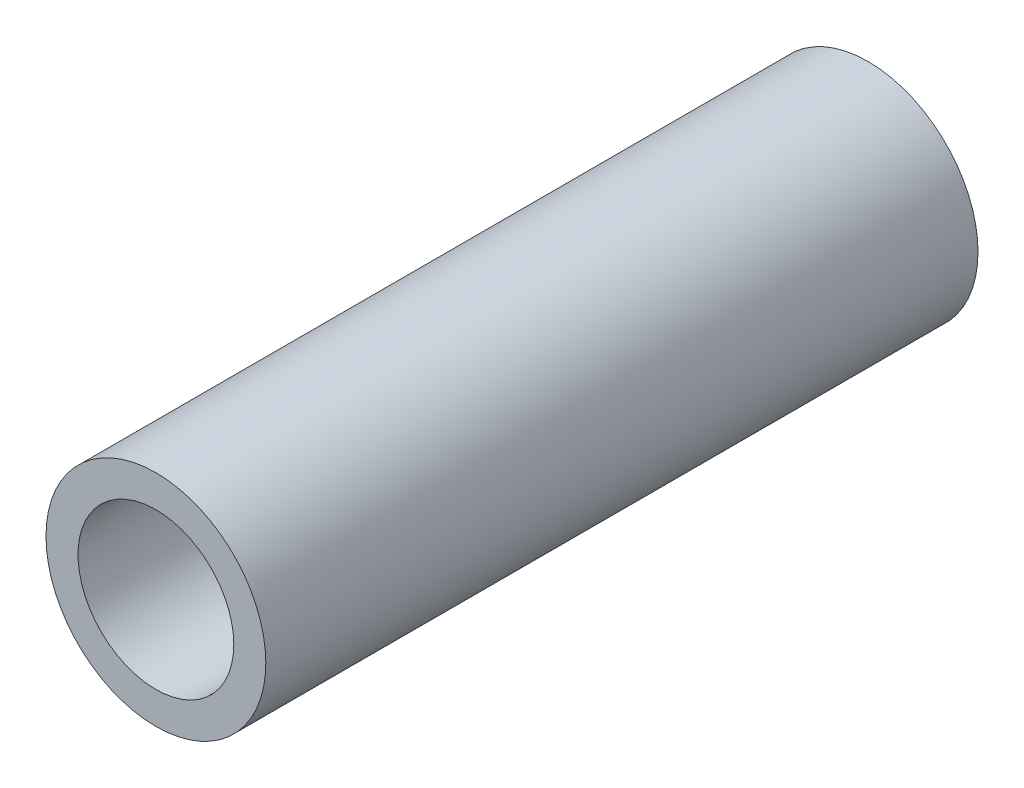
ISO-10303-21;
HEADER;
FILE_DESCRIPTION(('STEP AP214'),'2;1');
FILE_NAME('part.step','',(''),(''),'','','');
FILE_SCHEMA(('AUTOMOTIVE_DESIGN { 1 0 10303 214 1 1 1 1 }'));
ENDSEC;
DATA;
#1=APPLICATION_CONTEXT('core data for automotive mechanical design processes');
#2=APPLICATION_PROTOCOL_DEFINITION('international standard','automotive_design',2000,#1);
#3=PRODUCT_CONTEXT('',#1,'mechanical');
#4=PRODUCT('Part','Part','',(#3));
#5=PRODUCT_RELATED_PRODUCT_CATEGORY('part','',(#4));
#6=PRODUCT_DEFINITION_FORMATION('','',#4);
#7=PRODUCT_DEFINITION_CONTEXT('part definition',#1,'design');
#8=PRODUCT_DEFINITION('design','',#6,#7);
#9=PRODUCT_DEFINITION_SHAPE('','',#8);
#10=(LENGTH_UNIT() NAMED_UNIT(*) SI_UNIT(.MILLI.,.METRE.));
#11=(NAMED_UNIT(*) PLANE_ANGLE_UNIT() SI_UNIT($,.RADIAN.));
#12=(NAMED_UNIT(*) SI_UNIT($,.STERADIAN.) SOLID_ANGLE_UNIT());
#13=UNCERTAINTY_MEASURE_WITH_UNIT(LENGTH_MEASURE(1.E-05),#10,'distance_accuracy_value','');
#14=(GEOMETRIC_REPRESENTATION_CONTEXT(3) GLOBAL_UNCERTAINTY_ASSIGNED_CONTEXT((#13)) GLOBAL_UNIT_ASSIGNED_CONTEXT((#10,
#11,#12)) REPRESENTATION_CONTEXT('',''));
#15=CARTESIAN_POINT('',(0.,0.,0.));
#16=DIRECTION('',(0.,0.,1.));
#17=DIRECTION('',(1.,0.,0.));
#18=AXIS2_PLACEMENT_3D('',#15,#16,#17);
#19=CARTESIAN_POINT('',(0.,0.,20.574));
#20=DIRECTION('',(0.,0.,1.));
#21=DIRECTION('',(1.,0.,0.));
#22=AXIS2_PLACEMENT_3D('',#19,#20,#21);
#23=PLANE('',#22);
#24=CARTESIAN_POINT('',(0.,0.,20.574));
#25=DIRECTION('',(0.,0.,1.));
#26=DIRECTION('',(1.,0.,0.));
#27=AXIS2_PLACEMENT_3D('',#24,#25,#26);
#28=CIRCLE('',#27,3.175);
#29=CARTESIAN_POINT('',(3.175,0.,20.574));
#30=VERTEX_POINT('',#29);
#31=EDGE_CURVE('E10',#30,#30,#28,.T.);
#32=ORIENTED_EDGE('',*,*,#31,.T.);
#33=EDGE_LOOP('',(#32));
#34=FACE_BOUND('',#33,.T.);
#35=CARTESIAN_POINT('',(0.,0.,20.574));
#36=DIRECTION('',(0.,0.,1.));
#37=DIRECTION('',(1.,0.,0.));
#38=AXIS2_PLACEMENT_3D('',#35,#36,#37);
#39=CIRCLE('',#38,2.2499955);
#40=CARTESIAN_POINT('',(2.2499955,0.,20.574));
#41=VERTEX_POINT('',#40);
#42=EDGE_CURVE('E42',#41,#41,#39,.T.);
#43=ORIENTED_EDGE('',*,*,#42,.F.);
#44=EDGE_LOOP('',(#43));
#45=FACE_BOUND('',#44,.T.);
#46=ADVANCED_FACE('F31',(#34,#45),#23,.T.);
#47=CARTESIAN_POINT('',(0.,0.,0.));
#48=DIRECTION('',(0.,0.,1.));
#49=DIRECTION('',(1.,0.,0.));
#50=AXIS2_PLACEMENT_3D('',#47,#48,#49);
#51=PLANE('',#50);
#52=CARTESIAN_POINT('',(0.,0.,0.));
#53=DIRECTION('',(0.,0.,1.));
#54=DIRECTION('',(1.,0.,0.));
#55=AXIS2_PLACEMENT_3D('',#52,#53,#54);
#56=CIRCLE('',#55,3.175);
#57=CARTESIAN_POINT('',(3.175,0.,0.));
#58=VERTEX_POINT('',#57);
#59=EDGE_CURVE('E35',#58,#58,#56,.T.);
#60=ORIENTED_EDGE('',*,*,#59,.F.);
#61=EDGE_LOOP('',(#60));
#62=FACE_BOUND('',#61,.T.);
#63=CARTESIAN_POINT('',(0.,0.,0.));
#64=DIRECTION('',(0.,0.,1.));
#65=DIRECTION('',(1.,0.,0.));
#66=AXIS2_PLACEMENT_3D('',#63,#64,#65);
#67=CIRCLE('',#66,2.2499955);
#68=CARTESIAN_POINT('',(2.2499955,0.,0.));
#69=VERTEX_POINT('',#68);
#70=EDGE_CURVE('E44',#69,#69,#67,.T.);
#71=ORIENTED_EDGE('',*,*,#70,.T.);
#72=EDGE_LOOP('',(#71));
#73=FACE_BOUND('',#72,.T.);
#74=ADVANCED_FACE('F54',(#62,#73),#51,.F.);
#75=CARTESIAN_POINT('',(0.,0.,20.574));
#76=DIRECTION('',(0.,0.,-1.));
#77=DIRECTION('',(-1.,0.,0.));
#78=AXIS2_PLACEMENT_3D('',#75,#76,#77);
#79=CYLINDRICAL_SURFACE('',#78,3.175);
#80=ORIENTED_EDGE('',*,*,#31,.F.);
#81=EDGE_LOOP('',(#80));
#82=FACE_BOUND('',#81,.T.);
#83=ORIENTED_EDGE('',*,*,#59,.T.);
#84=EDGE_LOOP('',(#83));
#85=FACE_BOUND('',#84,.T.);
#86=ADVANCED_FACE('F33',(#82,#85),#79,.T.);
#87=CARTESIAN_POINT('',(0.,0.,20.574));
#88=DIRECTION('',(0.,0.,-1.));
#89=DIRECTION('',(-1.,0.,0.));
#90=AXIS2_PLACEMENT_3D('',#87,#88,#89);
#91=CYLINDRICAL_SURFACE('',#90,2.2499955);
#92=ORIENTED_EDGE('',*,*,#42,.T.);
#93=EDGE_LOOP('',(#92));
#94=FACE_BOUND('',#93,.T.);
#95=ORIENTED_EDGE('',*,*,#70,.F.);
#96=EDGE_LOOP('',(#95));
#97=FACE_BOUND('',#96,.T.);
#98=ADVANCED_FACE('F50',(#94,#97),#91,.F.);
#99=CLOSED_SHELL('',(#46,#74,#86,#98));
#100=MANIFOLD_SOLID_BREP('B2',#99);
#101=ADVANCED_BREP_SHAPE_REPRESENTATION('',(#18,#100),#14);
#102=SHAPE_DEFINITION_REPRESENTATION(#9,#101);
ENDSEC;
END-ISO-10303-21;
